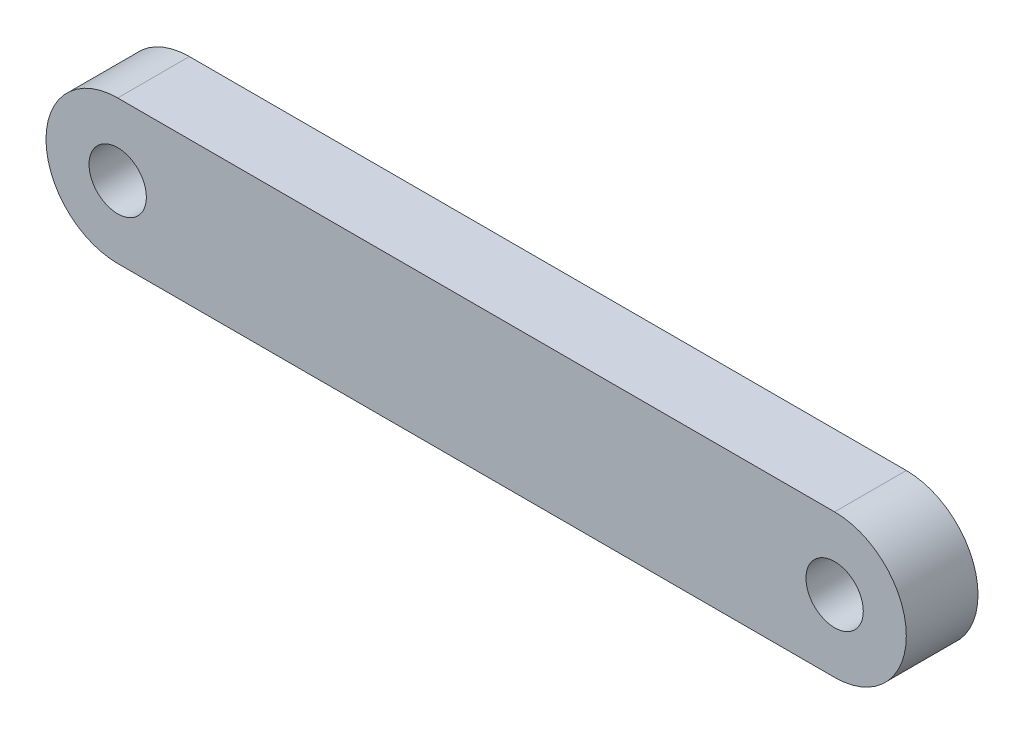
ISO-10303-21;
HEADER;
FILE_DESCRIPTION(('STEP AP214'),'2;1');
FILE_NAME('part.step','',(''),(''),'','','');
FILE_SCHEMA(('AUTOMOTIVE_DESIGN { 1 0 10303 214 1 1 1 1 }'));
ENDSEC;
DATA;
#1=APPLICATION_CONTEXT('core data for automotive mechanical design processes');
#2=APPLICATION_PROTOCOL_DEFINITION('international standard','automotive_design',2000,#1);
#3=PRODUCT_CONTEXT('',#1,'mechanical');
#4=PRODUCT('Part','Part','',(#3));
#5=PRODUCT_RELATED_PRODUCT_CATEGORY('part','',(#4));
#6=PRODUCT_DEFINITION_FORMATION('','',#4);
#7=PRODUCT_DEFINITION_CONTEXT('part definition',#1,'design');
#8=PRODUCT_DEFINITION('design','',#6,#7);
#9=PRODUCT_DEFINITION_SHAPE('','',#8);
#10=(LENGTH_UNIT() NAMED_UNIT(*) SI_UNIT(.MILLI.,.METRE.));
#11=(NAMED_UNIT(*) PLANE_ANGLE_UNIT() SI_UNIT($,.RADIAN.));
#12=(NAMED_UNIT(*) SI_UNIT($,.STERADIAN.) SOLID_ANGLE_UNIT());
#13=UNCERTAINTY_MEASURE_WITH_UNIT(LENGTH_MEASURE(1.E-05),#10,'distance_accuracy_value','');
#14=(GEOMETRIC_REPRESENTATION_CONTEXT(3) GLOBAL_UNCERTAINTY_ASSIGNED_CONTEXT((#13)) GLOBAL_UNIT_ASSIGNED_CONTEXT((#10,
#11,#12)) REPRESENTATION_CONTEXT('',''));
#15=CARTESIAN_POINT('',(0.,0.,0.));
#16=DIRECTION('',(0.,0.,1.));
#17=DIRECTION('',(1.,0.,0.));
#18=AXIS2_PLACEMENT_3D('',#15,#16,#17);
#19=CARTESIAN_POINT('',(0.,0.,5.));
#20=DIRECTION('',(0.,0.,1.));
#21=DIRECTION('',(1.,0.,0.));
#22=AXIS2_PLACEMENT_3D('',#19,#20,#21);
#23=PLANE('',#22);
#24=CARTESIAN_POINT('',(0.,0.,5.));
#25=DIRECTION('',(0.,0.,1.));
#26=DIRECTION('',(1.,0.,0.));
#27=AXIS2_PLACEMENT_3D('',#24,#25,#26);
#28=CIRCLE('',#27,2.);
#29=CARTESIAN_POINT('',(2.,0.,5.));
#30=VERTEX_POINT('',#29);
#31=EDGE_CURVE('E100',#30,#30,#28,.T.);
#32=ORIENTED_EDGE('',*,*,#31,.F.);
#33=EDGE_LOOP('',(#32));
#34=FACE_BOUND('',#33,.T.);
#35=CARTESIAN_POINT('',(0.,0.,5.));
#36=DIRECTION('',(0.,0.,1.));
#37=DIRECTION('',(1.,0.,0.));
#38=AXIS2_PLACEMENT_3D('',#35,#36,#37);
#39=CIRCLE('',#38,5.);
#40=CARTESIAN_POINT('',(0.,5.,5.));
#41=VERTEX_POINT('',#40);
#42=CARTESIAN_POINT('',(0.,-5.,5.));
#43=VERTEX_POINT('',#42);
#44=EDGE_CURVE('E85',#41,#43,#39,.T.);
#45=ORIENTED_EDGE('',*,*,#44,.T.);
#46=DIRECTION('',(1.,0.,0.));
#47=VECTOR('',#46,1.);
#48=CARTESIAN_POINT('',(0.,-5.,5.));
#49=LINE('',#48,#47);
#50=CARTESIAN_POINT('',(50.,-5.,5.));
#51=VERTEX_POINT('',#50);
#52=EDGE_CURVE('E80',#43,#51,#49,.T.);
#53=ORIENTED_EDGE('',*,*,#52,.T.);
#54=CARTESIAN_POINT('',(50.,0.,5.));
#55=DIRECTION('',(0.,0.,1.));
#56=DIRECTION('',(1.,0.,0.));
#57=AXIS2_PLACEMENT_3D('',#54,#55,#56);
#58=CIRCLE('',#57,5.);
#59=CARTESIAN_POINT('',(50.,5.,5.));
#60=VERTEX_POINT('',#59);
#61=EDGE_CURVE('E83',#51,#60,#58,.T.);
#62=ORIENTED_EDGE('',*,*,#61,.T.);
#63=DIRECTION('',(-1.,0.,0.));
#64=VECTOR('',#63,1.);
#65=CARTESIAN_POINT('',(0.,5.,5.));
#66=LINE('',#65,#64);
#67=EDGE_CURVE('E50',#60,#41,#66,.T.);
#68=ORIENTED_EDGE('',*,*,#67,.T.);
#69=EDGE_LOOP('',(#45,#53,#62,#68));
#70=FACE_BOUND('',#69,.T.);
#71=CARTESIAN_POINT('',(50.,0.,5.));
#72=DIRECTION('',(0.,0.,1.));
#73=DIRECTION('',(1.,0.,0.));
#74=AXIS2_PLACEMENT_3D('',#71,#72,#73);
#75=CIRCLE('',#74,2.);
#76=CARTESIAN_POINT('',(52.,0.,5.));
#77=VERTEX_POINT('',#76);
#78=EDGE_CURVE('E115',#77,#77,#75,.T.);
#79=ORIENTED_EDGE('',*,*,#78,.F.);
#80=EDGE_LOOP('',(#79));
#81=FACE_BOUND('',#80,.T.);
#82=ADVANCED_FACE('F33',(#34,#70,#81),#23,.T.);
#83=CARTESIAN_POINT('',(0.,0.,0.));
#84=DIRECTION('',(0.,0.,1.));
#85=DIRECTION('',(1.,0.,0.));
#86=AXIS2_PLACEMENT_3D('',#83,#84,#85);
#87=PLANE('',#86);
#88=CARTESIAN_POINT('',(0.,0.,0.));
#89=DIRECTION('',(0.,0.,1.));
#90=DIRECTION('',(1.,0.,0.));
#91=AXIS2_PLACEMENT_3D('',#88,#89,#90);
#92=CIRCLE('',#91,5.);
#93=CARTESIAN_POINT('',(0.,5.,0.));
#94=VERTEX_POINT('',#93);
#95=CARTESIAN_POINT('',(0.,-5.,0.));
#96=VERTEX_POINT('',#95);
#97=EDGE_CURVE('E97',#94,#96,#92,.T.);
#98=ORIENTED_EDGE('',*,*,#97,.F.);
#99=DIRECTION('',(-1.,0.,0.));
#100=VECTOR('',#99,1.);
#101=CARTESIAN_POINT('',(0.,5.,0.));
#102=LINE('',#101,#100);
#103=CARTESIAN_POINT('',(50.,5.,0.));
#104=VERTEX_POINT('',#103);
#105=EDGE_CURVE('E73',#104,#94,#102,.T.);
#106=ORIENTED_EDGE('',*,*,#105,.F.);
#107=CARTESIAN_POINT('',(50.,0.,0.));
#108=DIRECTION('',(0.,0.,1.));
#109=DIRECTION('',(1.,0.,0.));
#110=AXIS2_PLACEMENT_3D('',#107,#108,#109);
#111=CIRCLE('',#110,5.);
#112=CARTESIAN_POINT('',(50.,-5.,0.));
#113=VERTEX_POINT('',#112);
#114=EDGE_CURVE('E67',#113,#104,#111,.T.);
#115=ORIENTED_EDGE('',*,*,#114,.F.);
#116=DIRECTION('',(1.,0.,0.));
#117=VECTOR('',#116,1.);
#118=CARTESIAN_POINT('',(0.,-5.,0.));
#119=LINE('',#118,#117);
#120=EDGE_CURVE('E89',#96,#113,#119,.T.);
#121=ORIENTED_EDGE('',*,*,#120,.F.);
#122=EDGE_LOOP('',(#98,#106,#115,#121));
#123=FACE_BOUND('',#122,.T.);
#124=CARTESIAN_POINT('',(0.,0.,0.));
#125=DIRECTION('',(0.,0.,1.));
#126=DIRECTION('',(1.,0.,0.));
#127=AXIS2_PLACEMENT_3D('',#124,#125,#126);
#128=CIRCLE('',#127,2.);
#129=CARTESIAN_POINT('',(2.,0.,0.));
#130=VERTEX_POINT('',#129);
#131=EDGE_CURVE('E112',#130,#130,#128,.T.);
#132=ORIENTED_EDGE('',*,*,#131,.T.);
#133=EDGE_LOOP('',(#132));
#134=FACE_BOUND('',#133,.T.);
#135=CARTESIAN_POINT('',(50.,0.,0.));
#136=DIRECTION('',(0.,0.,1.));
#137=DIRECTION('',(1.,0.,0.));
#138=AXIS2_PLACEMENT_3D('',#135,#136,#137);
#139=CIRCLE('',#138,2.);
#140=CARTESIAN_POINT('',(52.,0.,0.));
#141=VERTEX_POINT('',#140);
#142=EDGE_CURVE('E118',#141,#141,#139,.T.);
#143=ORIENTED_EDGE('',*,*,#142,.T.);
#144=EDGE_LOOP('',(#143));
#145=FACE_BOUND('',#144,.T.);
#146=ADVANCED_FACE('F108',(#123,#134,#145),#87,.F.);
#147=CARTESIAN_POINT('',(0.,0.,5.));
#148=DIRECTION('',(0.,0.,-1.));
#149=DIRECTION('',(-1.,0.,0.));
#150=AXIS2_PLACEMENT_3D('',#147,#148,#149);
#151=CYLINDRICAL_SURFACE('',#150,5.);
#152=ORIENTED_EDGE('',*,*,#97,.T.);
#153=DIRECTION('',(0.,0.,-1.));
#154=VECTOR('',#153,1.);
#155=CARTESIAN_POINT('',(0.,-5.,5.));
#156=LINE('',#155,#154);
#157=EDGE_CURVE('E11',#43,#96,#156,.T.);
#158=ORIENTED_EDGE('',*,*,#157,.F.);
#159=ORIENTED_EDGE('',*,*,#44,.F.);
#160=DIRECTION('',(0.,0.,-1.));
#161=VECTOR('',#160,1.);
#162=CARTESIAN_POINT('',(0.,5.,5.));
#163=LINE('',#162,#161);
#164=EDGE_CURVE('E93',#41,#94,#163,.T.);
#165=ORIENTED_EDGE('',*,*,#164,.T.);
#166=EDGE_LOOP('',(#152,#158,#159,#165));
#167=FACE_BOUND('',#166,.T.);
#168=ADVANCED_FACE('F35',(#167),#151,.T.);
#169=CARTESIAN_POINT('',(0.,-5.,5.));
#170=DIRECTION('',(0.,1.,0.));
#171=DIRECTION('',(0.,0.,1.));
#172=AXIS2_PLACEMENT_3D('',#169,#170,#171);
#173=PLANE('',#172);
#174=ORIENTED_EDGE('',*,*,#120,.T.);
#175=DIRECTION('',(0.,0.,-1.));
#176=VECTOR('',#175,1.);
#177=CARTESIAN_POINT('',(50.,-5.,5.));
#178=LINE('',#177,#176);
#179=EDGE_CURVE('E42',#51,#113,#178,.T.);
#180=ORIENTED_EDGE('',*,*,#179,.F.);
#181=ORIENTED_EDGE('',*,*,#52,.F.);
#182=ORIENTED_EDGE('',*,*,#157,.T.);
#183=EDGE_LOOP('',(#174,#180,#181,#182));
#184=FACE_BOUND('',#183,.T.);
#185=ADVANCED_FACE('F88',(#184),#173,.F.);
#186=CARTESIAN_POINT('',(50.,0.,5.));
#187=DIRECTION('',(0.,0.,-1.));
#188=DIRECTION('',(-1.,0.,0.));
#189=AXIS2_PLACEMENT_3D('',#186,#187,#188);
#190=CYLINDRICAL_SURFACE('',#189,5.);
#191=ORIENTED_EDGE('',*,*,#114,.T.);
#192=DIRECTION('',(0.,0.,-1.));
#193=VECTOR('',#192,1.);
#194=CARTESIAN_POINT('',(50.,5.,5.));
#195=LINE('',#194,#193);
#196=EDGE_CURVE('E90',#60,#104,#195,.T.);
#197=ORIENTED_EDGE('',*,*,#196,.F.);
#198=ORIENTED_EDGE('',*,*,#61,.F.);
#199=ORIENTED_EDGE('',*,*,#179,.T.);
#200=EDGE_LOOP('',(#191,#197,#198,#199));
#201=FACE_BOUND('',#200,.T.);
#202=ADVANCED_FACE('F91',(#201),#190,.T.);
#203=CARTESIAN_POINT('',(0.,5.,5.));
#204=DIRECTION('',(0.,-1.,0.));
#205=DIRECTION('',(0.,0.,-1.));
#206=AXIS2_PLACEMENT_3D('',#203,#204,#205);
#207=PLANE('',#206);
#208=ORIENTED_EDGE('',*,*,#105,.T.);
#209=ORIENTED_EDGE('',*,*,#164,.F.);
#210=ORIENTED_EDGE('',*,*,#67,.F.);
#211=ORIENTED_EDGE('',*,*,#196,.T.);
#212=EDGE_LOOP('',(#208,#209,#210,#211));
#213=FACE_BOUND('',#212,.T.);
#214=ADVANCED_FACE('F105',(#213),#207,.F.);
#215=CARTESIAN_POINT('',(0.,0.,5.));
#216=DIRECTION('',(0.,0.,-1.));
#217=DIRECTION('',(-1.,0.,0.));
#218=AXIS2_PLACEMENT_3D('',#215,#216,#217);
#219=CYLINDRICAL_SURFACE('',#218,2.);
#220=ORIENTED_EDGE('',*,*,#31,.T.);
#221=EDGE_LOOP('',(#220));
#222=FACE_BOUND('',#221,.T.);
#223=ORIENTED_EDGE('',*,*,#131,.F.);
#224=EDGE_LOOP('',(#223));
#225=FACE_BOUND('',#224,.T.);
#226=ADVANCED_FACE('F135',(#222,#225),#219,.F.);
#227=CARTESIAN_POINT('',(50.,0.,5.));
#228=DIRECTION('',(0.,0.,-1.));
#229=DIRECTION('',(-1.,0.,0.));
#230=AXIS2_PLACEMENT_3D('',#227,#228,#229);
#231=CYLINDRICAL_SURFACE('',#230,2.);
#232=ORIENTED_EDGE('',*,*,#78,.T.);
#233=EDGE_LOOP('',(#232));
#234=FACE_BOUND('',#233,.T.);
#235=ORIENTED_EDGE('',*,*,#142,.F.);
#236=EDGE_LOOP('',(#235));
#237=FACE_BOUND('',#236,.T.);
#238=ADVANCED_FACE('F124',(#234,#237),#231,.F.);
#239=CLOSED_SHELL('',(#82,#146,#168,#185,#202,#214,#226,#238));
#240=MANIFOLD_SOLID_BREP('B2',#239);
#241=ADVANCED_BREP_SHAPE_REPRESENTATION('',(#18,#240),#14);
#242=SHAPE_DEFINITION_REPRESENTATION(#9,#241);
ENDSEC;
END-ISO-10303-21;
